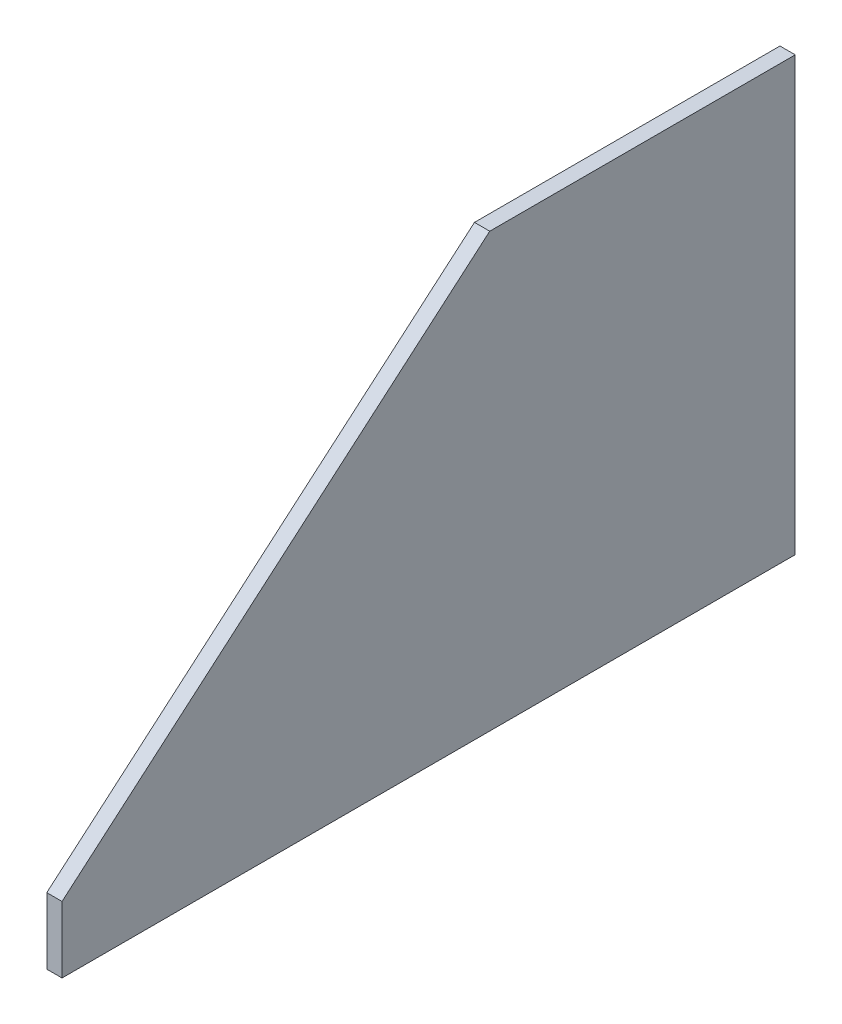
ISO-10303-21;
HEADER;
FILE_DESCRIPTION(('STEP AP214'),'2;1');
FILE_NAME('part.step','',(''),(''),'','','');
FILE_SCHEMA(('AUTOMOTIVE_DESIGN { 1 0 10303 214 1 1 1 1 }'));
ENDSEC;
DATA;
#1=APPLICATION_CONTEXT('core data for automotive mechanical design processes');
#2=APPLICATION_PROTOCOL_DEFINITION('international standard','automotive_design',2000,#1);
#3=PRODUCT_CONTEXT('',#1,'mechanical');
#4=PRODUCT('Part','Part','',(#3));
#5=PRODUCT_RELATED_PRODUCT_CATEGORY('part','',(#4));
#6=PRODUCT_DEFINITION_FORMATION('','',#4);
#7=PRODUCT_DEFINITION_CONTEXT('part definition',#1,'design');
#8=PRODUCT_DEFINITION('design','',#6,#7);
#9=PRODUCT_DEFINITION_SHAPE('','',#8);
#10=(LENGTH_UNIT() NAMED_UNIT(*) SI_UNIT(.MILLI.,.METRE.));
#11=(NAMED_UNIT(*) PLANE_ANGLE_UNIT() SI_UNIT($,.RADIAN.));
#12=(NAMED_UNIT(*) SI_UNIT($,.STERADIAN.) SOLID_ANGLE_UNIT());
#13=UNCERTAINTY_MEASURE_WITH_UNIT(LENGTH_MEASURE(1.E-05),#10,'distance_accuracy_value','');
#14=(GEOMETRIC_REPRESENTATION_CONTEXT(3) GLOBAL_UNCERTAINTY_ASSIGNED_CONTEXT((#13)) GLOBAL_UNIT_ASSIGNED_CONTEXT((#10,
#11,#12)) REPRESENTATION_CONTEXT('',''));
#15=CARTESIAN_POINT('',(0.,0.,0.));
#16=DIRECTION('',(0.,0.,1.));
#17=DIRECTION('',(1.,0.,0.));
#18=AXIS2_PLACEMENT_3D('',#15,#16,#17);
#19=CARTESIAN_POINT('',(6.35,0.,0.));
#20=DIRECTION('',(0.,0.,-1.));
#21=DIRECTION('',(0.,1.,0.));
#22=AXIS2_PLACEMENT_3D('',#19,#20,#21);
#23=PLANE('',#22);
#24=DIRECTION('',(0.,-1.,0.));
#25=VECTOR('',#24,1.);
#26=CARTESIAN_POINT('',(0.,0.,0.));
#27=LINE('',#26,#25);
#28=CARTESIAN_POINT('',(0.,152.4,0.));
#29=VERTEX_POINT('',#28);
#30=CARTESIAN_POINT('',(0.,-27.559,0.));
#31=VERTEX_POINT('',#30);
#32=EDGE_CURVE('E108',#29,#31,#27,.T.);
#33=ORIENTED_EDGE('',*,*,#32,.F.);
#34=DIRECTION('',(-1.,0.,0.));
#35=VECTOR('',#34,1.);
#36=CARTESIAN_POINT('',(6.35,152.4,0.));
#37=LINE('',#36,#35);
#38=CARTESIAN_POINT('',(6.35,152.4,0.));
#39=VERTEX_POINT('',#38);
#40=EDGE_CURVE('E11',#39,#29,#37,.T.);
#41=ORIENTED_EDGE('',*,*,#40,.F.);
#42=DIRECTION('',(0.,-1.,0.));
#43=VECTOR('',#42,1.);
#44=CARTESIAN_POINT('',(6.35,0.,0.));
#45=LINE('',#44,#43);
#46=CARTESIAN_POINT('',(6.35,-27.559,0.));
#47=VERTEX_POINT('',#46);
#48=EDGE_CURVE('E119',#39,#47,#45,.T.);
#49=ORIENTED_EDGE('',*,*,#48,.T.);
#50=DIRECTION('',(-1.,0.,0.));
#51=VECTOR('',#50,1.);
#52=CARTESIAN_POINT('',(6.35,-27.559,0.));
#53=LINE('',#52,#51);
#54=EDGE_CURVE('E51',#47,#31,#53,.T.);
#55=ORIENTED_EDGE('',*,*,#54,.T.);
#56=EDGE_LOOP('',(#33,#41,#49,#55));
#57=FACE_BOUND('',#56,.T.);
#58=ADVANCED_FACE('F35',(#57),#23,.T.);
#59=CARTESIAN_POINT('',(6.35,152.4,0.));
#60=DIRECTION('',(0.,1.,0.));
#61=DIRECTION('',(0.,0.,1.));
#62=AXIS2_PLACEMENT_3D('',#59,#60,#61);
#63=PLANE('',#62);
#64=DIRECTION('',(0.,0.,-1.));
#65=VECTOR('',#64,1.);
#66=CARTESIAN_POINT('',(0.,152.4,0.));
#67=LINE('',#66,#65);
#68=CARTESIAN_POINT('',(0.,152.4,127.));
#69=VERTEX_POINT('',#68);
#70=EDGE_CURVE('E110',#69,#29,#67,.T.);
#71=ORIENTED_EDGE('',*,*,#70,.F.);
#72=DIRECTION('',(-1.,0.,0.));
#73=VECTOR('',#72,1.);
#74=CARTESIAN_POINT('',(6.35,152.4,127.));
#75=LINE('',#74,#73);
#76=CARTESIAN_POINT('',(6.35,152.4,127.));
#77=VERTEX_POINT('',#76);
#78=EDGE_CURVE('E43',#77,#69,#75,.T.);
#79=ORIENTED_EDGE('',*,*,#78,.F.);
#80=DIRECTION('',(0.,0.,-1.));
#81=VECTOR('',#80,1.);
#82=CARTESIAN_POINT('',(6.35,152.4,0.));
#83=LINE('',#82,#81);
#84=EDGE_CURVE('E100',#77,#39,#83,.T.);
#85=ORIENTED_EDGE('',*,*,#84,.T.);
#86=ORIENTED_EDGE('',*,*,#40,.T.);
#87=EDGE_LOOP('',(#71,#79,#85,#86));
#88=FACE_BOUND('',#87,.T.);
#89=ADVANCED_FACE('F123',(#88),#63,.T.);
#90=CARTESIAN_POINT('',(6.35,150.607058823529,129.091764705882));
#91=DIRECTION('',(0.,0.759256602365296,0.650791373455969));
#92=DIRECTION('',(0.,-0.650791373455969,0.759256602365296));
#93=AXIS2_PLACEMENT_3D('',#90,#91,#92);
#94=PLANE('',#93);
#95=DIRECTION('',(0.,0.650791373455969,-0.759256602365297));
#96=VECTOR('',#95,1.);
#97=CARTESIAN_POINT('',(0.,150.607058823529,129.091764705882));
#98=LINE('',#97,#96);
#99=CARTESIAN_POINT('',(0.,0.,304.8));
#100=VERTEX_POINT('',#99);
#101=EDGE_CURVE('E88',#100,#69,#98,.T.);
#102=ORIENTED_EDGE('',*,*,#101,.F.);
#103=DIRECTION('',(-1.,0.,0.));
#104=VECTOR('',#103,1.);
#105=CARTESIAN_POINT('',(6.35,0.,304.8));
#106=LINE('',#105,#104);
#107=CARTESIAN_POINT('',(6.35,0.,304.8));
#108=VERTEX_POINT('',#107);
#109=EDGE_CURVE('E83',#108,#100,#106,.T.);
#110=ORIENTED_EDGE('',*,*,#109,.F.);
#111=DIRECTION('',(0.,0.650791373455969,-0.759256602365297));
#112=VECTOR('',#111,1.);
#113=CARTESIAN_POINT('',(6.35,150.607058823529,129.091764705882));
#114=LINE('',#113,#112);
#115=EDGE_CURVE('E86',#108,#77,#114,.T.);
#116=ORIENTED_EDGE('',*,*,#115,.T.);
#117=ORIENTED_EDGE('',*,*,#78,.T.);
#118=EDGE_LOOP('',(#102,#110,#116,#117));
#119=FACE_BOUND('',#118,.T.);
#120=ADVANCED_FACE('F85',(#119),#94,.T.);
#121=CARTESIAN_POINT('',(6.35,0.,304.8));
#122=DIRECTION('',(0.,0.,1.));
#123=DIRECTION('',(1.,0.,0.));
#124=AXIS2_PLACEMENT_3D('',#121,#122,#123);
#125=PLANE('',#124);
#126=DIRECTION('',(0.,1.,0.));
#127=VECTOR('',#126,1.);
#128=CARTESIAN_POINT('',(0.,0.,304.8));
#129=LINE('',#128,#127);
#130=CARTESIAN_POINT('',(0.,-27.559,304.8));
#131=VERTEX_POINT('',#130);
#132=EDGE_CURVE('E114',#131,#100,#129,.T.);
#133=ORIENTED_EDGE('',*,*,#132,.F.);
#134=DIRECTION('',(-1.,0.,0.));
#135=VECTOR('',#134,1.);
#136=CARTESIAN_POINT('',(6.35,-27.559,304.8));
#137=LINE('',#136,#135);
#138=CARTESIAN_POINT('',(6.35,-27.559,304.8));
#139=VERTEX_POINT('',#138);
#140=EDGE_CURVE('E67',#139,#131,#137,.T.);
#141=ORIENTED_EDGE('',*,*,#140,.F.);
#142=DIRECTION('',(0.,1.,0.));
#143=VECTOR('',#142,1.);
#144=CARTESIAN_POINT('',(6.35,0.,304.8));
#145=LINE('',#144,#143);
#146=EDGE_CURVE('E98',#139,#108,#145,.T.);
#147=ORIENTED_EDGE('',*,*,#146,.T.);
#148=ORIENTED_EDGE('',*,*,#109,.T.);
#149=EDGE_LOOP('',(#133,#141,#147,#148));
#150=FACE_BOUND('',#149,.T.);
#151=ADVANCED_FACE('F102',(#150),#125,.T.);
#152=CARTESIAN_POINT('',(6.35,-27.559,0.));
#153=DIRECTION('',(0.,-1.,0.));
#154=DIRECTION('',(0.,0.,-1.));
#155=AXIS2_PLACEMENT_3D('',#152,#153,#154);
#156=PLANE('',#155);
#157=DIRECTION('',(0.,0.,1.));
#158=VECTOR('',#157,1.);
#159=CARTESIAN_POINT('',(0.,-27.559,0.));
#160=LINE('',#159,#158);
#161=EDGE_CURVE('E116',#31,#131,#160,.T.);
#162=ORIENTED_EDGE('',*,*,#161,.F.);
#163=ORIENTED_EDGE('',*,*,#54,.F.);
#164=DIRECTION('',(0.,0.,1.));
#165=VECTOR('',#164,1.);
#166=CARTESIAN_POINT('',(6.35,-27.559,0.));
#167=LINE('',#166,#165);
#168=EDGE_CURVE('E103',#47,#139,#167,.T.);
#169=ORIENTED_EDGE('',*,*,#168,.T.);
#170=ORIENTED_EDGE('',*,*,#140,.T.);
#171=EDGE_LOOP('',(#162,#163,#169,#170));
#172=FACE_BOUND('',#171,.T.);
#173=ADVANCED_FACE('F126',(#172),#156,.T.);
#174=CARTESIAN_POINT('',(6.35,0.,0.));
#175=DIRECTION('',(1.,0.,0.));
#176=DIRECTION('',(0.,0.,-1.));
#177=AXIS2_PLACEMENT_3D('',#174,#175,#176);
#178=PLANE('',#177);
#179=ORIENTED_EDGE('',*,*,#48,.F.);
#180=ORIENTED_EDGE('',*,*,#84,.F.);
#181=ORIENTED_EDGE('',*,*,#115,.F.);
#182=ORIENTED_EDGE('',*,*,#146,.F.);
#183=ORIENTED_EDGE('',*,*,#168,.F.);
#184=EDGE_LOOP('',(#179,#180,#181,#182,#183));
#185=FACE_BOUND('',#184,.T.);
#186=ADVANCED_FACE('F96',(#185),#178,.T.);
#187=CARTESIAN_POINT('',(0.,0.,0.));
#188=DIRECTION('',(1.,0.,0.));
#189=DIRECTION('',(0.,0.,-1.));
#190=AXIS2_PLACEMENT_3D('',#187,#188,#189);
#191=PLANE('',#190);
#192=ORIENTED_EDGE('',*,*,#32,.T.);
#193=ORIENTED_EDGE('',*,*,#161,.T.);
#194=ORIENTED_EDGE('',*,*,#132,.T.);
#195=ORIENTED_EDGE('',*,*,#101,.T.);
#196=ORIENTED_EDGE('',*,*,#70,.T.);
#197=EDGE_LOOP('',(#192,#193,#194,#195,#196));
#198=FACE_BOUND('',#197,.T.);
#199=ADVANCED_FACE('F125',(#198),#191,.F.);
#200=CLOSED_SHELL('',(#58,#89,#120,#151,#173,#186,#199));
#201=MANIFOLD_SOLID_BREP('B2',#200);
#202=ADVANCED_BREP_SHAPE_REPRESENTATION('',(#18,#201),#14);
#203=SHAPE_DEFINITION_REPRESENTATION(#9,#202);
ENDSEC;
END-ISO-10303-21;
